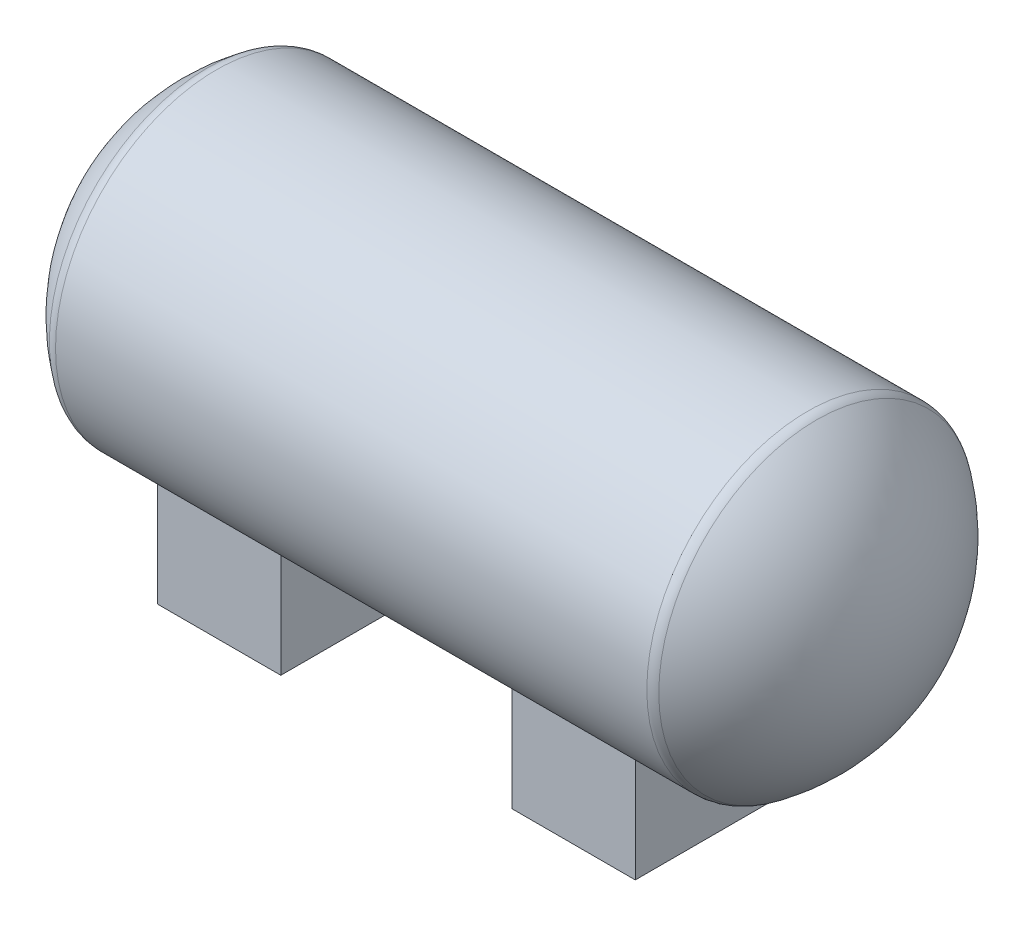
ISO-10303-21;
HEADER;
FILE_DESCRIPTION(('STEP AP214'),'2;1');
FILE_NAME('part.step','',(''),(''),'','','');
FILE_SCHEMA(('AUTOMOTIVE_DESIGN { 1 0 10303 214 1 1 1 1 }'));
ENDSEC;
DATA;
#1=APPLICATION_CONTEXT('core data for automotive mechanical design processes');
#2=APPLICATION_PROTOCOL_DEFINITION('international standard','automotive_design',2000,#1);
#3=PRODUCT_CONTEXT('',#1,'mechanical');
#4=PRODUCT('Part','Part','',(#3));
#5=PRODUCT_RELATED_PRODUCT_CATEGORY('part','',(#4));
#6=PRODUCT_DEFINITION_FORMATION('','',#4);
#7=PRODUCT_DEFINITION_CONTEXT('part definition',#1,'design');
#8=PRODUCT_DEFINITION('design','',#6,#7);
#9=PRODUCT_DEFINITION_SHAPE('','',#8);
#10=(LENGTH_UNIT() NAMED_UNIT(*) SI_UNIT(.MILLI.,.METRE.));
#11=(NAMED_UNIT(*) PLANE_ANGLE_UNIT() SI_UNIT($,.RADIAN.));
#12=(NAMED_UNIT(*) SI_UNIT($,.STERADIAN.) SOLID_ANGLE_UNIT());
#13=UNCERTAINTY_MEASURE_WITH_UNIT(LENGTH_MEASURE(1.E-05),#10,'distance_accuracy_value','');
#14=(GEOMETRIC_REPRESENTATION_CONTEXT(3) GLOBAL_UNCERTAINTY_ASSIGNED_CONTEXT((#13)) GLOBAL_UNIT_ASSIGNED_CONTEXT((#10,
#11,#12)) REPRESENTATION_CONTEXT('',''));
#15=CARTESIAN_POINT('',(0.,0.,0.));
#16=DIRECTION('',(0.,0.,1.));
#17=DIRECTION('',(1.,0.,0.));
#18=AXIS2_PLACEMENT_3D('',#15,#16,#17);
#19=CARTESIAN_POINT('',(-12.3499999999074,0.,0.));
#20=DIRECTION('',(-1.,0.,0.));
#21=DIRECTION('',(0.,1.,0.));
#22=AXIS2_PLACEMENT_3D('',#19,#20,#21);
#23=SPHERICAL_SURFACE('',#22,12.6500000000925);
#24=CARTESIAN_POINT('',(-19.7698130996348,0.,0.));
#25=DIRECTION('',(1.,0.,0.));
#26=DIRECTION('',(0.,0.,-1.));
#27=AXIS2_PLACEMENT_3D('',#24,#25,#26);
#28=CIRCLE('',#27,10.2454318389932);
#29=CARTESIAN_POINT('',(-19.7698130996348,0.,-10.2454318389932));
#30=VERTEX_POINT('',#29);
#31=EDGE_CURVE('E178',#30,#30,#28,.F.);
#32=ORIENTED_EDGE('',*,*,#31,.T.);
#33=EDGE_LOOP('',(#32));
#34=FACE_BOUND('',#33,.T.);
#35=ADVANCED_FACE('F33',(#34),#23,.T.);
#36=CARTESIAN_POINT('',(12.3499999999074,0.,0.));
#37=DIRECTION('',(-1.,0.,0.));
#38=DIRECTION('',(0.,1.,0.));
#39=AXIS2_PLACEMENT_3D('',#36,#37,#38);
#40=SPHERICAL_SURFACE('',#39,12.6500000000925);
#41=CARTESIAN_POINT('',(19.7698130996348,0.,0.));
#42=DIRECTION('',(-1.,0.,0.));
#43=DIRECTION('',(0.,0.,1.));
#44=AXIS2_PLACEMENT_3D('',#41,#42,#43);
#45=CIRCLE('',#44,10.2454318389932);
#46=CARTESIAN_POINT('',(19.7698130996348,0.,10.2454318389932));
#47=VERTEX_POINT('',#46);
#48=EDGE_CURVE('E11',#47,#47,#45,.F.);
#49=ORIENTED_EDGE('',*,*,#48,.T.);
#50=EDGE_LOOP('',(#49));
#51=FACE_BOUND('',#50,.T.);
#52=ADVANCED_FACE('F196',(#51),#40,.T.);
#53=CARTESIAN_POINT('',(-19.5,0.,0.));
#54=DIRECTION('',(-1.,0.,0.));
#55=DIRECTION('',(0.,0.,1.));
#56=AXIS2_PLACEMENT_3D('',#53,#54,#55);
#57=CYLINDRICAL_SURFACE('',#56,10.4355162786044);
#58=CARTESIAN_POINT('',(-19.1832666095421,0.,0.));
#59=DIRECTION('',(1.,0.,0.));
#60=DIRECTION('',(0.,0.,-1.));
#61=AXIS2_PLACEMENT_3D('',#58,#59,#60);
#62=CIRCLE('',#61,10.4355162786044);
#63=CARTESIAN_POINT('',(-19.1832666095421,0.,-10.4355162786044));
#64=VERTEX_POINT('',#63);
#65=EDGE_CURVE('E41',#64,#64,#62,.T.);
#66=ORIENTED_EDGE('',*,*,#65,.T.);
#67=EDGE_LOOP('',(#66));
#68=FACE_BOUND('',#67,.T.);
#69=CARTESIAN_POINT('',(19.1832666095421,0.,0.));
#70=DIRECTION('',(-1.,0.,0.));
#71=DIRECTION('',(0.,0.,1.));
#72=AXIS2_PLACEMENT_3D('',#69,#70,#71);
#73=CIRCLE('',#72,10.4355162786044);
#74=CARTESIAN_POINT('',(19.1832666095421,0.,10.4355162786044));
#75=VERTEX_POINT('',#74);
#76=EDGE_CURVE('E181',#75,#75,#73,.T.);
#77=ORIENTED_EDGE('',*,*,#76,.T.);
#78=EDGE_LOOP('',(#77));
#79=FACE_BOUND('',#78,.T.);
#80=DIRECTION('',(-1.,0.,0.));
#81=VECTOR('',#80,1.);
#82=CARTESIAN_POINT('',(-19.5,-7.25603197353883,-7.49999999999999));
#83=LINE('',#82,#81);
#84=CARTESIAN_POINT('',(15.5,-7.25603197353883,-7.5));
#85=VERTEX_POINT('',#84);
#86=CARTESIAN_POINT('',(7.50000000000001,-7.25603197353883,-7.5));
#87=VERTEX_POINT('',#86);
#88=EDGE_CURVE('E173',#85,#87,#83,.T.);
#89=ORIENTED_EDGE('',*,*,#88,.T.);
#90=CARTESIAN_POINT('',(7.50000000000001,0.,0.));
#91=DIRECTION('',(-1.,0.,0.));
#92=DIRECTION('',(0.,0.,1.));
#93=AXIS2_PLACEMENT_3D('',#90,#91,#92);
#94=CIRCLE('',#93,10.4355162786044);
#95=CARTESIAN_POINT('',(7.50000000000001,-7.25603197353882,7.5));
#96=VERTEX_POINT('',#95);
#97=EDGE_CURVE('E176',#87,#96,#94,.T.);
#98=ORIENTED_EDGE('',*,*,#97,.T.);
#99=DIRECTION('',(-1.,0.,0.));
#100=VECTOR('',#99,1.);
#101=CARTESIAN_POINT('',(-19.5,-7.25603197353882,7.5));
#102=LINE('',#101,#100);
#103=CARTESIAN_POINT('',(15.5,-7.25603197353882,7.5));
#104=VERTEX_POINT('',#103);
#105=EDGE_CURVE('E101',#96,#104,#102,.F.);
#106=ORIENTED_EDGE('',*,*,#105,.T.);
#107=CARTESIAN_POINT('',(15.5,0.,0.));
#108=DIRECTION('',(1.,0.,0.));
#109=DIRECTION('',(0.,0.,-1.));
#110=AXIS2_PLACEMENT_3D('',#107,#108,#109);
#111=CIRCLE('',#110,10.4355162786044);
#112=EDGE_CURVE('E170',#104,#85,#111,.T.);
#113=ORIENTED_EDGE('',*,*,#112,.T.);
#114=EDGE_LOOP('',(#89,#98,#106,#113));
#115=FACE_BOUND('',#114,.T.);
#116=DIRECTION('',(-1.,0.,0.));
#117=VECTOR('',#116,1.);
#118=CARTESIAN_POINT('',(-19.5,-7.25603197353882,-7.5));
#119=LINE('',#118,#117);
#120=CARTESIAN_POINT('',(-7.5,-7.25603197353882,-7.5));
#121=VERTEX_POINT('',#120);
#122=CARTESIAN_POINT('',(-15.5,-7.25603197353882,-7.5));
#123=VERTEX_POINT('',#122);
#124=EDGE_CURVE('E163',#121,#123,#119,.T.);
#125=ORIENTED_EDGE('',*,*,#124,.T.);
#126=CARTESIAN_POINT('',(-15.5,0.,0.));
#127=DIRECTION('',(-1.,0.,0.));
#128=DIRECTION('',(0.,0.,1.));
#129=AXIS2_PLACEMENT_3D('',#126,#127,#128);
#130=CIRCLE('',#129,10.4355162786044);
#131=CARTESIAN_POINT('',(-15.5,-7.25603197353883,7.5));
#132=VERTEX_POINT('',#131);
#133=EDGE_CURVE('E166',#123,#132,#130,.T.);
#134=ORIENTED_EDGE('',*,*,#133,.T.);
#135=DIRECTION('',(-1.,0.,0.));
#136=VECTOR('',#135,1.);
#137=CARTESIAN_POINT('',(-19.5,-7.25603197353883,7.5));
#138=LINE('',#137,#136);
#139=CARTESIAN_POINT('',(-7.5,-7.25603197353883,7.5));
#140=VERTEX_POINT('',#139);
#141=EDGE_CURVE('E151',#132,#140,#138,.F.);
#142=ORIENTED_EDGE('',*,*,#141,.T.);
#143=CARTESIAN_POINT('',(-7.5,0.,0.));
#144=DIRECTION('',(1.,0.,0.));
#145=DIRECTION('',(0.,0.,-1.));
#146=AXIS2_PLACEMENT_3D('',#143,#144,#145);
#147=CIRCLE('',#146,10.4355162786044);
#148=EDGE_CURVE('E160',#140,#121,#147,.T.);
#149=ORIENTED_EDGE('',*,*,#148,.T.);
#150=EDGE_LOOP('',(#125,#134,#142,#149));
#151=FACE_BOUND('',#150,.T.);
#152=ADVANCED_FACE('F186',(#68,#79,#115,#151),#57,.T.);
#153=CARTESIAN_POINT('',(-7.5,-14.,-7.5));
#154=DIRECTION('',(0.,0.,-1.));
#155=DIRECTION('',(-1.,0.,0.));
#156=AXIS2_PLACEMENT_3D('',#153,#154,#155);
#157=PLANE('',#156);
#158=ORIENTED_EDGE('',*,*,#124,.F.);
#159=DIRECTION('',(0.,1.,0.));
#160=VECTOR('',#159,1.);
#161=CARTESIAN_POINT('',(-7.5,-14.,-7.5));
#162=LINE('',#161,#160);
#163=CARTESIAN_POINT('',(-7.5,-14.,-7.5));
#164=VERTEX_POINT('',#163);
#165=EDGE_CURVE('E152',#164,#121,#162,.T.);
#166=ORIENTED_EDGE('',*,*,#165,.F.);
#167=DIRECTION('',(-1.,0.,0.));
#168=VECTOR('',#167,1.);
#169=CARTESIAN_POINT('',(-7.5,-14.,-7.5));
#170=LINE('',#169,#168);
#171=CARTESIAN_POINT('',(-15.5,-14.,-7.5));
#172=VERTEX_POINT('',#171);
#173=EDGE_CURVE('E144',#164,#172,#170,.T.);
#174=ORIENTED_EDGE('',*,*,#173,.T.);
#175=DIRECTION('',(0.,1.,0.));
#176=VECTOR('',#175,1.);
#177=CARTESIAN_POINT('',(-15.5,-14.,-7.5));
#178=LINE('',#177,#176);
#179=EDGE_CURVE('E148',#172,#123,#178,.T.);
#180=ORIENTED_EDGE('',*,*,#179,.T.);
#181=EDGE_LOOP('',(#158,#166,#174,#180));
#182=FACE_BOUND('',#181,.T.);
#183=ADVANCED_FACE('F206',(#182),#157,.T.);
#184=CARTESIAN_POINT('',(-7.5,-14.,7.5));
#185=DIRECTION('',(0.,0.,1.));
#186=DIRECTION('',(1.,0.,0.));
#187=AXIS2_PLACEMENT_3D('',#184,#185,#186);
#188=PLANE('',#187);
#189=ORIENTED_EDGE('',*,*,#141,.F.);
#190=DIRECTION('',(0.,1.,0.));
#191=VECTOR('',#190,1.);
#192=CARTESIAN_POINT('',(-15.5,-14.,7.5));
#193=LINE('',#192,#191);
#194=CARTESIAN_POINT('',(-15.5,-14.,7.5));
#195=VERTEX_POINT('',#194);
#196=EDGE_CURVE('E147',#195,#132,#193,.T.);
#197=ORIENTED_EDGE('',*,*,#196,.F.);
#198=DIRECTION('',(1.,0.,0.));
#199=VECTOR('',#198,1.);
#200=CARTESIAN_POINT('',(-7.5,-14.,7.5));
#201=LINE('',#200,#199);
#202=CARTESIAN_POINT('',(-7.5,-14.,7.5));
#203=VERTEX_POINT('',#202);
#204=EDGE_CURVE('E139',#195,#203,#201,.T.);
#205=ORIENTED_EDGE('',*,*,#204,.T.);
#206=DIRECTION('',(0.,1.,0.));
#207=VECTOR('',#206,1.);
#208=CARTESIAN_POINT('',(-7.5,-14.,7.5));
#209=LINE('',#208,#207);
#210=EDGE_CURVE('E56',#203,#140,#209,.T.);
#211=ORIENTED_EDGE('',*,*,#210,.T.);
#212=EDGE_LOOP('',(#189,#197,#205,#211));
#213=FACE_BOUND('',#212,.T.);
#214=ADVANCED_FACE('F211',(#213),#188,.T.);
#215=CARTESIAN_POINT('',(-15.5,-14.,7.5));
#216=DIRECTION('',(-1.,0.,0.));
#217=DIRECTION('',(0.,0.,1.));
#218=AXIS2_PLACEMENT_3D('',#215,#216,#217);
#219=PLANE('',#218);
#220=ORIENTED_EDGE('',*,*,#133,.F.);
#221=ORIENTED_EDGE('',*,*,#179,.F.);
#222=DIRECTION('',(0.,0.,1.));
#223=VECTOR('',#222,1.);
#224=CARTESIAN_POINT('',(-15.5,-14.,7.5));
#225=LINE('',#224,#223);
#226=EDGE_CURVE('E132',#172,#195,#225,.T.);
#227=ORIENTED_EDGE('',*,*,#226,.T.);
#228=ORIENTED_EDGE('',*,*,#196,.T.);
#229=EDGE_LOOP('',(#220,#221,#227,#228));
#230=FACE_BOUND('',#229,.T.);
#231=ADVANCED_FACE('F207',(#230),#219,.T.);
#232=CARTESIAN_POINT('',(-7.5,-14.,7.5));
#233=DIRECTION('',(1.,0.,0.));
#234=DIRECTION('',(0.,0.,-1.));
#235=AXIS2_PLACEMENT_3D('',#232,#233,#234);
#236=PLANE('',#235);
#237=ORIENTED_EDGE('',*,*,#148,.F.);
#238=ORIENTED_EDGE('',*,*,#210,.F.);
#239=DIRECTION('',(0.,0.,-1.));
#240=VECTOR('',#239,1.);
#241=CARTESIAN_POINT('',(-7.5,-14.,7.5));
#242=LINE('',#241,#240);
#243=EDGE_CURVE('E141',#203,#164,#242,.T.);
#244=ORIENTED_EDGE('',*,*,#243,.T.);
#245=ORIENTED_EDGE('',*,*,#165,.T.);
#246=EDGE_LOOP('',(#237,#238,#244,#245));
#247=FACE_BOUND('',#246,.T.);
#248=ADVANCED_FACE('F210',(#247),#236,.T.);
#249=CARTESIAN_POINT('',(0.,-14.,0.));
#250=DIRECTION('',(0.,1.,0.));
#251=DIRECTION('',(0.,0.,1.));
#252=AXIS2_PLACEMENT_3D('',#249,#250,#251);
#253=PLANE('',#252);
#254=CARTESIAN_POINT('',(-11.5,-14.,0.));
#255=DIRECTION('',(0.,-1.,0.));
#256=DIRECTION('',(0.,0.,-1.));
#257=AXIS2_PLACEMENT_3D('',#254,#255,#256);
#258=CIRCLE('',#257,1.5);
#259=CARTESIAN_POINT('',(-11.5,-14.,-1.5));
#260=VERTEX_POINT('',#259);
#261=EDGE_CURVE('E126',#260,#260,#258,.T.);
#262=ORIENTED_EDGE('',*,*,#261,.F.);
#263=EDGE_LOOP('',(#262));
#264=FACE_BOUND('',#263,.T.);
#265=ORIENTED_EDGE('',*,*,#226,.F.);
#266=ORIENTED_EDGE('',*,*,#173,.F.);
#267=ORIENTED_EDGE('',*,*,#243,.F.);
#268=ORIENTED_EDGE('',*,*,#204,.F.);
#269=EDGE_LOOP('',(#265,#266,#267,#268));
#270=FACE_BOUND('',#269,.T.);
#271=ADVANCED_FACE('F217',(#264,#270),#253,.F.);
#272=CARTESIAN_POINT('',(15.5,-14.,-7.5));
#273=DIRECTION('',(0.,0.,-1.));
#274=DIRECTION('',(-1.,0.,0.));
#275=AXIS2_PLACEMENT_3D('',#272,#273,#274);
#276=PLANE('',#275);
#277=ORIENTED_EDGE('',*,*,#88,.F.);
#278=DIRECTION('',(0.,1.,0.));
#279=VECTOR('',#278,1.);
#280=CARTESIAN_POINT('',(15.5,-14.,-7.5));
#281=LINE('',#280,#279);
#282=CARTESIAN_POINT('',(15.5,-14.,-7.5));
#283=VERTEX_POINT('',#282);
#284=EDGE_CURVE('E133',#283,#85,#281,.T.);
#285=ORIENTED_EDGE('',*,*,#284,.F.);
#286=DIRECTION('',(-1.,0.,0.));
#287=VECTOR('',#286,1.);
#288=CARTESIAN_POINT('',(15.5,-14.,-7.5));
#289=LINE('',#288,#287);
#290=CARTESIAN_POINT('',(7.50000000000001,-14.,-7.5));
#291=VERTEX_POINT('',#290);
#292=EDGE_CURVE('E105',#283,#291,#289,.T.);
#293=ORIENTED_EDGE('',*,*,#292,.T.);
#294=DIRECTION('',(0.,1.,0.));
#295=VECTOR('',#294,1.);
#296=CARTESIAN_POINT('',(7.50000000000001,-14.,-7.5));
#297=LINE('',#296,#295);
#298=EDGE_CURVE('E119',#291,#87,#297,.T.);
#299=ORIENTED_EDGE('',*,*,#298,.T.);
#300=EDGE_LOOP('',(#277,#285,#293,#299));
#301=FACE_BOUND('',#300,.T.);
#302=ADVANCED_FACE('F224',(#301),#276,.T.);
#303=CARTESIAN_POINT('',(15.5,-14.,7.5));
#304=DIRECTION('',(0.,0.,1.));
#305=DIRECTION('',(1.,0.,0.));
#306=AXIS2_PLACEMENT_3D('',#303,#304,#305);
#307=PLANE('',#306);
#308=ORIENTED_EDGE('',*,*,#105,.F.);
#309=DIRECTION('',(0.,1.,0.));
#310=VECTOR('',#309,1.);
#311=CARTESIAN_POINT('',(7.50000000000001,-14.,7.5));
#312=LINE('',#311,#310);
#313=CARTESIAN_POINT('',(7.50000000000001,-14.,7.5));
#314=VERTEX_POINT('',#313);
#315=EDGE_CURVE('E96',#314,#96,#312,.T.);
#316=ORIENTED_EDGE('',*,*,#315,.F.);
#317=DIRECTION('',(1.,0.,0.));
#318=VECTOR('',#317,1.);
#319=CARTESIAN_POINT('',(15.5,-14.,7.5));
#320=LINE('',#319,#318);
#321=CARTESIAN_POINT('',(15.5,-14.,7.5));
#322=VERTEX_POINT('',#321);
#323=EDGE_CURVE('E99',#314,#322,#320,.T.);
#324=ORIENTED_EDGE('',*,*,#323,.T.);
#325=DIRECTION('',(0.,1.,0.));
#326=VECTOR('',#325,1.);
#327=CARTESIAN_POINT('',(15.5,-14.,7.5));
#328=LINE('',#327,#326);
#329=EDGE_CURVE('E48',#322,#104,#328,.T.);
#330=ORIENTED_EDGE('',*,*,#329,.T.);
#331=EDGE_LOOP('',(#308,#316,#324,#330));
#332=FACE_BOUND('',#331,.T.);
#333=ADVANCED_FACE('F98',(#332),#307,.T.);
#334=CARTESIAN_POINT('',(7.50000000000001,-14.,7.5));
#335=DIRECTION('',(-1.,0.,0.));
#336=DIRECTION('',(0.,0.,1.));
#337=AXIS2_PLACEMENT_3D('',#334,#335,#336);
#338=PLANE('',#337);
#339=ORIENTED_EDGE('',*,*,#97,.F.);
#340=ORIENTED_EDGE('',*,*,#298,.F.);
#341=DIRECTION('',(0.,0.,1.));
#342=VECTOR('',#341,1.);
#343=CARTESIAN_POINT('',(7.50000000000001,-14.,7.5));
#344=LINE('',#343,#342);
#345=EDGE_CURVE('E112',#291,#314,#344,.T.);
#346=ORIENTED_EDGE('',*,*,#345,.T.);
#347=ORIENTED_EDGE('',*,*,#315,.T.);
#348=EDGE_LOOP('',(#339,#340,#346,#347));
#349=FACE_BOUND('',#348,.T.);
#350=ADVANCED_FACE('F117',(#349),#338,.T.);
#351=CARTESIAN_POINT('',(15.5,-14.,7.5));
#352=DIRECTION('',(1.,0.,0.));
#353=DIRECTION('',(0.,0.,-1.));
#354=AXIS2_PLACEMENT_3D('',#351,#352,#353);
#355=PLANE('',#354);
#356=ORIENTED_EDGE('',*,*,#112,.F.);
#357=ORIENTED_EDGE('',*,*,#329,.F.);
#358=DIRECTION('',(0.,0.,-1.));
#359=VECTOR('',#358,1.);
#360=CARTESIAN_POINT('',(15.5,-14.,7.5));
#361=LINE('',#360,#359);
#362=EDGE_CURVE('E115',#322,#283,#361,.T.);
#363=ORIENTED_EDGE('',*,*,#362,.T.);
#364=ORIENTED_EDGE('',*,*,#284,.T.);
#365=EDGE_LOOP('',(#356,#357,#363,#364));
#366=FACE_BOUND('',#365,.T.);
#367=ADVANCED_FACE('F228',(#366),#355,.T.);
#368=CARTESIAN_POINT('',(0.,-14.,0.));
#369=DIRECTION('',(0.,1.,0.));
#370=DIRECTION('',(0.,0.,1.));
#371=AXIS2_PLACEMENT_3D('',#368,#369,#370);
#372=PLANE('',#371);
#373=CARTESIAN_POINT('',(11.5,-14.,0.));
#374=DIRECTION('',(0.,-1.,0.));
#375=DIRECTION('',(0.,0.,-1.));
#376=AXIS2_PLACEMENT_3D('',#373,#374,#375);
#377=CIRCLE('',#376,1.5);
#378=CARTESIAN_POINT('',(11.5,-14.,-1.5));
#379=VERTEX_POINT('',#378);
#380=EDGE_CURVE('E123',#379,#379,#377,.T.);
#381=ORIENTED_EDGE('',*,*,#380,.F.);
#382=EDGE_LOOP('',(#381));
#383=FACE_BOUND('',#382,.T.);
#384=ORIENTED_EDGE('',*,*,#345,.F.);
#385=ORIENTED_EDGE('',*,*,#292,.F.);
#386=ORIENTED_EDGE('',*,*,#362,.F.);
#387=ORIENTED_EDGE('',*,*,#323,.F.);
#388=EDGE_LOOP('',(#384,#385,#386,#387));
#389=FACE_BOUND('',#388,.T.);
#390=ADVANCED_FACE('F110',(#383,#389),#372,.F.);
#391=CARTESIAN_POINT('',(11.5,-4.,0.));
#392=DIRECTION('',(0.,-1.,0.));
#393=DIRECTION('',(0.,0.,-1.));
#394=AXIS2_PLACEMENT_3D('',#391,#392,#393);
#395=CYLINDRICAL_SURFACE('',#394,1.5);
#396=CARTESIAN_POINT('',(11.5,-4.,0.));
#397=DIRECTION('',(0.,-1.,0.));
#398=DIRECTION('',(0.,0.,-1.));
#399=AXIS2_PLACEMENT_3D('',#396,#397,#398);
#400=CIRCLE('',#399,1.5);
#401=CARTESIAN_POINT('',(11.5,-4.,-1.5));
#402=VERTEX_POINT('',#401);
#403=EDGE_CURVE('E120',#402,#402,#400,.T.);
#404=ORIENTED_EDGE('',*,*,#403,.F.);
#405=EDGE_LOOP('',(#404));
#406=FACE_BOUND('',#405,.T.);
#407=ORIENTED_EDGE('',*,*,#380,.T.);
#408=EDGE_LOOP('',(#407));
#409=FACE_BOUND('',#408,.T.);
#410=ADVANCED_FACE('F239',(#406,#409),#395,.F.);
#411=CARTESIAN_POINT('',(11.5,-4.,0.));
#412=DIRECTION('',(0.,-1.,0.));
#413=DIRECTION('',(0.,0.,-1.));
#414=AXIS2_PLACEMENT_3D('',#411,#412,#413);
#415=PLANE('',#414);
#416=ORIENTED_EDGE('',*,*,#403,.T.);
#417=EDGE_LOOP('',(#416));
#418=FACE_BOUND('',#417,.T.);
#419=ADVANCED_FACE('F244',(#418),#415,.T.);
#420=CARTESIAN_POINT('',(-11.5,-4.,0.));
#421=DIRECTION('',(0.,-1.,0.));
#422=DIRECTION('',(0.,0.,-1.));
#423=AXIS2_PLACEMENT_3D('',#420,#421,#422);
#424=CYLINDRICAL_SURFACE('',#423,1.5);
#425=CARTESIAN_POINT('',(-11.5,-4.,0.));
#426=DIRECTION('',(0.,-1.,0.));
#427=DIRECTION('',(0.,0.,-1.));
#428=AXIS2_PLACEMENT_3D('',#425,#426,#427);
#429=CIRCLE('',#428,1.5);
#430=CARTESIAN_POINT('',(-11.5,-4.,-1.5));
#431=VERTEX_POINT('',#430);
#432=EDGE_CURVE('E260',#431,#431,#429,.T.);
#433=ORIENTED_EDGE('',*,*,#432,.F.);
#434=EDGE_LOOP('',(#433));
#435=FACE_BOUND('',#434,.T.);
#436=ORIENTED_EDGE('',*,*,#261,.T.);
#437=EDGE_LOOP('',(#436));
#438=FACE_BOUND('',#437,.T.);
#439=ADVANCED_FACE('F241',(#435,#438),#424,.F.);
#440=CARTESIAN_POINT('',(-11.5,-4.,0.));
#441=DIRECTION('',(0.,-1.,0.));
#442=DIRECTION('',(0.,0.,-1.));
#443=AXIS2_PLACEMENT_3D('',#440,#441,#442);
#444=PLANE('',#443);
#445=ORIENTED_EDGE('',*,*,#432,.T.);
#446=EDGE_LOOP('',(#445));
#447=FACE_BOUND('',#446,.T.);
#448=ADVANCED_FACE('F192',(#447),#444,.T.);
#449=CARTESIAN_POINT('',(-19.1832666095421,0.,0.));
#450=DIRECTION('',(1.,0.,0.));
#451=DIRECTION('',(0.,0.,-1.));
#452=AXIS2_PLACEMENT_3D('',#449,#450,#451);
#453=TOROIDAL_SURFACE('',#452,9.43551627860442,1.);
#454=ORIENTED_EDGE('',*,*,#65,.F.);
#455=EDGE_LOOP('',(#454));
#456=FACE_BOUND('',#455,.T.);
#457=ORIENTED_EDGE('',*,*,#31,.F.);
#458=EDGE_LOOP('',(#457));
#459=FACE_BOUND('',#458,.T.);
#460=ADVANCED_FACE('F189',(#456,#459),#453,.T.);
#461=CARTESIAN_POINT('',(19.1832666095421,0.,0.));
#462=DIRECTION('',(-1.,0.,0.));
#463=DIRECTION('',(0.,0.,1.));
#464=AXIS2_PLACEMENT_3D('',#461,#462,#463);
#465=TOROIDAL_SURFACE('',#464,9.43551627860442,1.);
#466=ORIENTED_EDGE('',*,*,#48,.F.);
#467=EDGE_LOOP('',(#466));
#468=FACE_BOUND('',#467,.T.);
#469=ORIENTED_EDGE('',*,*,#76,.F.);
#470=EDGE_LOOP('',(#469));
#471=FACE_BOUND('',#470,.T.);
#472=ADVANCED_FACE('F35',(#468,#471),#465,.T.);
#473=CLOSED_SHELL('',(#35,#52,#152,#183,#214,#231,#248,#271,#302,#333,#350,#367,#390,#410,#419,
#439,#448,#460,#472));
#474=MANIFOLD_SOLID_BREP('B2',#473);
#475=ADVANCED_BREP_SHAPE_REPRESENTATION('',(#18,#474),#14);
#476=SHAPE_DEFINITION_REPRESENTATION(#9,#475);
ENDSEC;
END-ISO-10303-21;
